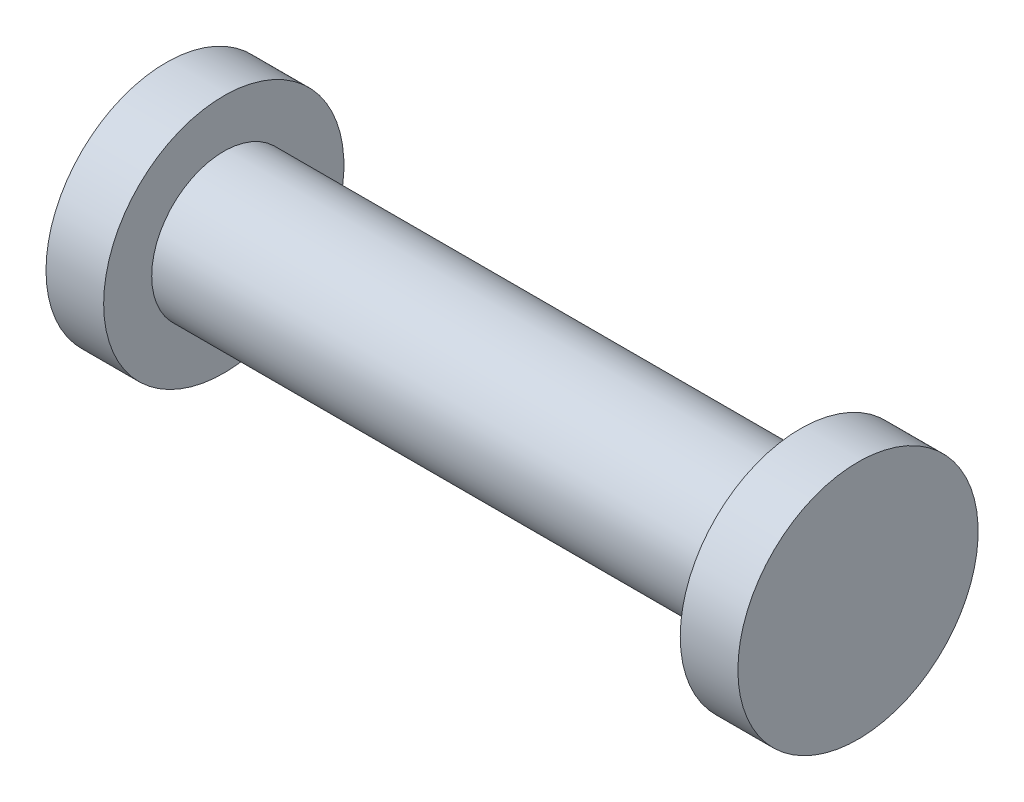
ISO-10303-21;
HEADER;
FILE_DESCRIPTION(('STEP AP214'),'2;1');
FILE_NAME('part.step','',(''),(''),'','','');
FILE_SCHEMA(('AUTOMOTIVE_DESIGN { 1 0 10303 214 1 1 1 1 }'));
ENDSEC;
DATA;
#1=APPLICATION_CONTEXT('core data for automotive mechanical design processes');
#2=APPLICATION_PROTOCOL_DEFINITION('international standard','automotive_design',2000,#1);
#3=PRODUCT_CONTEXT('',#1,'mechanical');
#4=PRODUCT('Part','Part','',(#3));
#5=PRODUCT_RELATED_PRODUCT_CATEGORY('part','',(#4));
#6=PRODUCT_DEFINITION_FORMATION('','',#4);
#7=PRODUCT_DEFINITION_CONTEXT('part definition',#1,'design');
#8=PRODUCT_DEFINITION('design','',#6,#7);
#9=PRODUCT_DEFINITION_SHAPE('','',#8);
#10=(LENGTH_UNIT() NAMED_UNIT(*) SI_UNIT(.MILLI.,.METRE.));
#11=(NAMED_UNIT(*) PLANE_ANGLE_UNIT() SI_UNIT($,.RADIAN.));
#12=(NAMED_UNIT(*) SI_UNIT($,.STERADIAN.) SOLID_ANGLE_UNIT());
#13=UNCERTAINTY_MEASURE_WITH_UNIT(LENGTH_MEASURE(1.E-05),#10,'distance_accuracy_value','');
#14=(GEOMETRIC_REPRESENTATION_CONTEXT(3) GLOBAL_UNCERTAINTY_ASSIGNED_CONTEXT((#13)) GLOBAL_UNIT_ASSIGNED_CONTEXT((#10,
#11,#12)) REPRESENTATION_CONTEXT('',''));
#15=CARTESIAN_POINT('',(0.,0.,0.));
#16=DIRECTION('',(0.,0.,1.));
#17=DIRECTION('',(1.,0.,0.));
#18=AXIS2_PLACEMENT_3D('',#15,#16,#17);
#19=CARTESIAN_POINT('',(36.,0.,-12.5));
#20=DIRECTION('',(-1.,0.,0.));
#21=DIRECTION('',(0.,0.,1.));
#22=AXIS2_PLACEMENT_3D('',#19,#20,#21);
#23=PLANE('',#22);
#24=CARTESIAN_POINT('',(36.,0.,0.));
#25=DIRECTION('',(-1.,0.,0.));
#26=DIRECTION('',(0.,0.,1.));
#27=AXIS2_PLACEMENT_3D('',#24,#25,#26);
#28=CIRCLE('',#27,12.5);
#29=CARTESIAN_POINT('',(36.,0.,12.5));
#30=VERTEX_POINT('',#29);
#31=EDGE_CURVE('E56',#30,#30,#28,.T.);
#32=ORIENTED_EDGE('',*,*,#31,.F.);
#33=EDGE_LOOP('',(#32));
#34=FACE_BOUND('',#33,.T.);
#35=ADVANCED_FACE('F34',(#34),#23,.F.);
#36=CARTESIAN_POINT('',(-36.,0.,0.));
#37=DIRECTION('',(1.,0.,0.));
#38=DIRECTION('',(0.,0.,-1.));
#39=AXIS2_PLACEMENT_3D('',#36,#37,#38);
#40=PLANE('',#39);
#41=CARTESIAN_POINT('',(-36.,0.,0.));
#42=DIRECTION('',(-1.,0.,0.));
#43=DIRECTION('',(0.,0.,1.));
#44=AXIS2_PLACEMENT_3D('',#41,#42,#43);
#45=CIRCLE('',#44,12.5);
#46=CARTESIAN_POINT('',(-36.,0.,12.5));
#47=VERTEX_POINT('',#46);
#48=EDGE_CURVE('E10',#47,#47,#45,.T.);
#49=ORIENTED_EDGE('',*,*,#48,.T.);
#50=EDGE_LOOP('',(#49));
#51=FACE_BOUND('',#50,.T.);
#52=ADVANCED_FACE('F63',(#51),#40,.F.);
#53=CARTESIAN_POINT('',(0.,0.,0.));
#54=DIRECTION('',(-1.,0.,0.));
#55=DIRECTION('',(0.,0.,1.));
#56=AXIS2_PLACEMENT_3D('',#53,#54,#55);
#57=CYLINDRICAL_SURFACE('',#56,12.5);
#58=ORIENTED_EDGE('',*,*,#48,.F.);
#59=EDGE_LOOP('',(#58));
#60=FACE_BOUND('',#59,.T.);
#61=CARTESIAN_POINT('',(-30.,0.,0.));
#62=DIRECTION('',(-1.,0.,0.));
#63=DIRECTION('',(0.,0.,1.));
#64=AXIS2_PLACEMENT_3D('',#61,#62,#63);
#65=CIRCLE('',#64,12.5);
#66=CARTESIAN_POINT('',(-30.,0.,12.5));
#67=VERTEX_POINT('',#66);
#68=EDGE_CURVE('E40',#67,#67,#65,.T.);
#69=ORIENTED_EDGE('',*,*,#68,.T.);
#70=EDGE_LOOP('',(#69));
#71=FACE_BOUND('',#70,.T.);
#72=ADVANCED_FACE('F67',(#60,#71),#57,.T.);
#73=CARTESIAN_POINT('',(-30.,0.,-12.5));
#74=DIRECTION('',(-1.,0.,0.));
#75=DIRECTION('',(0.,0.,1.));
#76=AXIS2_PLACEMENT_3D('',#73,#74,#75);
#77=PLANE('',#76);
#78=ORIENTED_EDGE('',*,*,#68,.F.);
#79=EDGE_LOOP('',(#78));
#80=FACE_BOUND('',#79,.T.);
#81=CARTESIAN_POINT('',(-30.,0.,0.));
#82=DIRECTION('',(-1.,0.,0.));
#83=DIRECTION('',(0.,0.,1.));
#84=AXIS2_PLACEMENT_3D('',#81,#82,#83);
#85=CIRCLE('',#84,7.49999999999999);
#86=CARTESIAN_POINT('',(-30.,0.,7.49999999999999));
#87=VERTEX_POINT('',#86);
#88=EDGE_CURVE('E44',#87,#87,#85,.T.);
#89=ORIENTED_EDGE('',*,*,#88,.T.);
#90=EDGE_LOOP('',(#89));
#91=FACE_BOUND('',#90,.T.);
#92=ADVANCED_FACE('F71',(#80,#91),#77,.F.);
#93=CARTESIAN_POINT('',(0.,0.,0.));
#94=DIRECTION('',(-1.,0.,0.));
#95=DIRECTION('',(0.,0.,1.));
#96=AXIS2_PLACEMENT_3D('',#93,#94,#95);
#97=CYLINDRICAL_SURFACE('',#96,7.5);
#98=ORIENTED_EDGE('',*,*,#88,.F.);
#99=EDGE_LOOP('',(#98));
#100=FACE_BOUND('',#99,.T.);
#101=CARTESIAN_POINT('',(30.,0.,0.));
#102=DIRECTION('',(-1.,0.,0.));
#103=DIRECTION('',(0.,0.,1.));
#104=AXIS2_PLACEMENT_3D('',#101,#102,#103);
#105=CIRCLE('',#104,7.50000000000001);
#106=CARTESIAN_POINT('',(30.,0.,7.50000000000001));
#107=VERTEX_POINT('',#106);
#108=EDGE_CURVE('E48',#107,#107,#105,.T.);
#109=ORIENTED_EDGE('',*,*,#108,.T.);
#110=EDGE_LOOP('',(#109));
#111=FACE_BOUND('',#110,.T.);
#112=ADVANCED_FACE('F77',(#100,#111),#97,.T.);
#113=CARTESIAN_POINT('',(30.,0.,-7.50000000000001));
#114=DIRECTION('',(1.,0.,0.));
#115=DIRECTION('',(0.,0.,-1.));
#116=AXIS2_PLACEMENT_3D('',#113,#114,#115);
#117=PLANE('',#116);
#118=ORIENTED_EDGE('',*,*,#108,.F.);
#119=EDGE_LOOP('',(#118));
#120=FACE_BOUND('',#119,.T.);
#121=CARTESIAN_POINT('',(30.,0.,0.));
#122=DIRECTION('',(-1.,0.,0.));
#123=DIRECTION('',(0.,0.,1.));
#124=AXIS2_PLACEMENT_3D('',#121,#122,#123);
#125=CIRCLE('',#124,12.5);
#126=CARTESIAN_POINT('',(30.,0.,12.5));
#127=VERTEX_POINT('',#126);
#128=EDGE_CURVE('E53',#127,#127,#125,.T.);
#129=ORIENTED_EDGE('',*,*,#128,.T.);
#130=EDGE_LOOP('',(#129));
#131=FACE_BOUND('',#130,.T.);
#132=ADVANCED_FACE('F81',(#120,#131),#117,.F.);
#133=CARTESIAN_POINT('',(0.,0.,0.));
#134=DIRECTION('',(-1.,0.,0.));
#135=DIRECTION('',(0.,0.,1.));
#136=AXIS2_PLACEMENT_3D('',#133,#134,#135);
#137=CYLINDRICAL_SURFACE('',#136,12.5);
#138=ORIENTED_EDGE('',*,*,#128,.F.);
#139=EDGE_LOOP('',(#138));
#140=FACE_BOUND('',#139,.T.);
#141=ORIENTED_EDGE('',*,*,#31,.T.);
#142=EDGE_LOOP('',(#141));
#143=FACE_BOUND('',#142,.T.);
#144=ADVANCED_FACE('F60',(#140,#143),#137,.T.);
#145=CLOSED_SHELL('',(#35,#52,#72,#92,#112,#132,#144));
#146=MANIFOLD_SOLID_BREP('B2',#145);
#147=ADVANCED_BREP_SHAPE_REPRESENTATION('',(#18,#146),#14);
#148=SHAPE_DEFINITION_REPRESENTATION(#9,#147);
ENDSEC;
END-ISO-10303-21;
